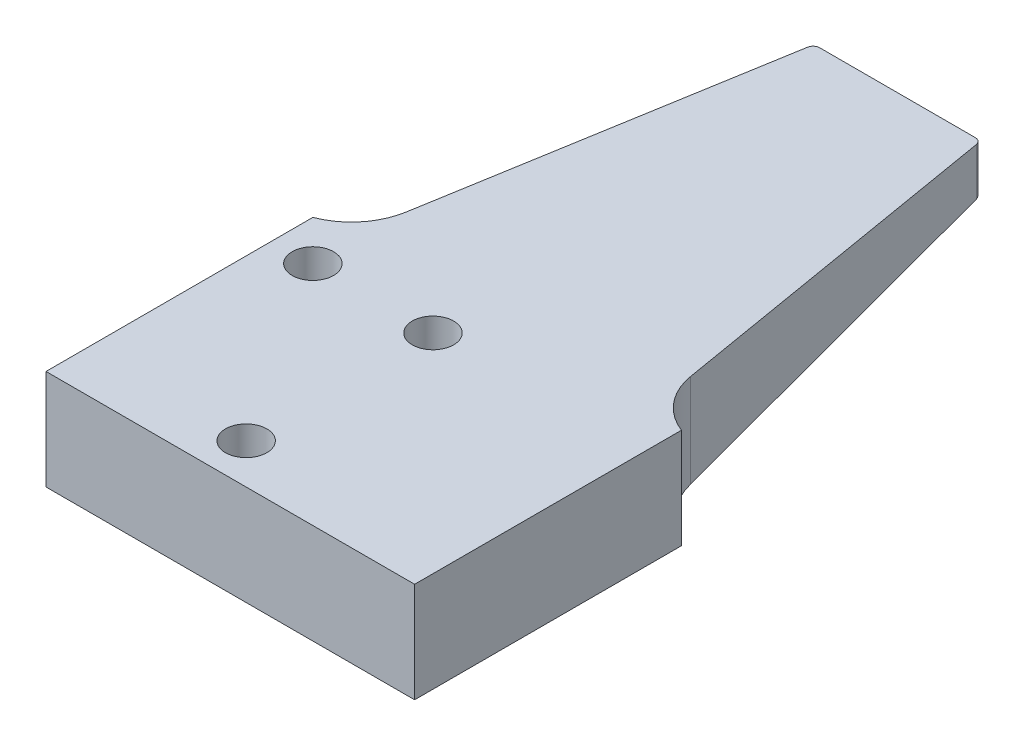
ISO-10303-21;
HEADER;
FILE_DESCRIPTION(('STEP AP214'),'2;1');
FILE_NAME('part.step','',(''),(''),'','','');
FILE_SCHEMA(('AUTOMOTIVE_DESIGN { 1 0 10303 214 1 1 1 1 }'));
ENDSEC;
DATA;
#1=APPLICATION_CONTEXT('core data for automotive mechanical design processes');
#2=APPLICATION_PROTOCOL_DEFINITION('international standard','automotive_design',2000,#1);
#3=PRODUCT_CONTEXT('',#1,'mechanical');
#4=PRODUCT('Part','Part','',(#3));
#5=PRODUCT_RELATED_PRODUCT_CATEGORY('part','',(#4));
#6=PRODUCT_DEFINITION_FORMATION('','',#4);
#7=PRODUCT_DEFINITION_CONTEXT('part definition',#1,'design');
#8=PRODUCT_DEFINITION('design','',#6,#7);
#9=PRODUCT_DEFINITION_SHAPE('','',#8);
#10=(LENGTH_UNIT() NAMED_UNIT(*) SI_UNIT(.MILLI.,.METRE.));
#11=(NAMED_UNIT(*) PLANE_ANGLE_UNIT() SI_UNIT($,.RADIAN.));
#12=(NAMED_UNIT(*) SI_UNIT($,.STERADIAN.) SOLID_ANGLE_UNIT());
#13=UNCERTAINTY_MEASURE_WITH_UNIT(LENGTH_MEASURE(1.E-05),#10,'distance_accuracy_value','');
#14=(GEOMETRIC_REPRESENTATION_CONTEXT(3) GLOBAL_UNCERTAINTY_ASSIGNED_CONTEXT((#13)) GLOBAL_UNIT_ASSIGNED_CONTEXT((#10,
#11,#12)) REPRESENTATION_CONTEXT('',''));
#15=CARTESIAN_POINT('',(0.,0.,0.));
#16=DIRECTION('',(0.,0.,1.));
#17=DIRECTION('',(1.,0.,0.));
#18=AXIS2_PLACEMENT_3D('',#15,#16,#17);
#19=CARTESIAN_POINT('',(24.,15.,-6.00000000000001));
#20=DIRECTION('',(0.,-1.,0.));
#21=DIRECTION('',(0.,0.,-1.));
#22=AXIS2_PLACEMENT_3D('',#19,#20,#21);
#23=CYLINDRICAL_SURFACE('',#22,1.6);
#24=CARTESIAN_POINT('',(24.,0.,-6.00000000000001));
#25=DIRECTION('',(0.,1.,0.));
#26=DIRECTION('',(0.,0.,1.));
#27=AXIS2_PLACEMENT_3D('',#24,#25,#26);
#28=CIRCLE('',#27,1.6);
#29=CARTESIAN_POINT('',(24.,0.,-4.40000000000001));
#30=VERTEX_POINT('',#29);
#31=EDGE_CURVE('E188',#30,#30,#28,.T.);
#32=ORIENTED_EDGE('',*,*,#31,.F.);
#33=EDGE_LOOP('',(#32));
#34=FACE_BOUND('',#33,.T.);
#35=CARTESIAN_POINT('',(24.,7.5,-6.00000000000001));
#36=DIRECTION('',(0.,1.,0.));
#37=DIRECTION('',(0.,0.,1.));
#38=AXIS2_PLACEMENT_3D('',#35,#36,#37);
#39=CIRCLE('',#38,1.6);
#40=CARTESIAN_POINT('',(24.,7.5,-4.40000000000001));
#41=VERTEX_POINT('',#40);
#42=EDGE_CURVE('E185',#41,#41,#39,.T.);
#43=ORIENTED_EDGE('',*,*,#42,.T.);
#44=EDGE_LOOP('',(#43));
#45=FACE_BOUND('',#44,.T.);
#46=ADVANCED_FACE('F35',(#34,#45),#23,.F.);
#47=CARTESIAN_POINT('',(6.,15.,-34.));
#48=DIRECTION('',(0.,-1.,0.));
#49=DIRECTION('',(0.,0.,-1.));
#50=AXIS2_PLACEMENT_3D('',#47,#48,#49);
#51=CYLINDRICAL_SURFACE('',#50,1.59999999999999);
#52=CARTESIAN_POINT('',(6.,0.,-34.));
#53=DIRECTION('',(0.,1.,0.));
#54=DIRECTION('',(0.,0.,1.));
#55=AXIS2_PLACEMENT_3D('',#52,#53,#54);
#56=CIRCLE('',#55,1.59999999999999);
#57=CARTESIAN_POINT('',(6.,0.,-32.4));
#58=VERTEX_POINT('',#57);
#59=EDGE_CURVE('E184',#58,#58,#56,.T.);
#60=ORIENTED_EDGE('',*,*,#59,.F.);
#61=EDGE_LOOP('',(#60));
#62=FACE_BOUND('',#61,.T.);
#63=CARTESIAN_POINT('',(6.,7.5,-34.));
#64=DIRECTION('',(0.,1.,0.));
#65=DIRECTION('',(0.,0.,1.));
#66=AXIS2_PLACEMENT_3D('',#63,#64,#65);
#67=CIRCLE('',#66,1.59999999999999);
#68=CARTESIAN_POINT('',(6.,7.5,-32.4));
#69=VERTEX_POINT('',#68);
#70=EDGE_CURVE('E210',#69,#69,#67,.T.);
#71=ORIENTED_EDGE('',*,*,#70,.T.);
#72=EDGE_LOOP('',(#71));
#73=FACE_BOUND('',#72,.T.);
#74=ADVANCED_FACE('F284',(#62,#73),#51,.F.);
#75=CARTESIAN_POINT('',(24.,15.,-34.));
#76=DIRECTION('',(0.,-1.,0.));
#77=DIRECTION('',(0.,0.,-1.));
#78=AXIS2_PLACEMENT_3D('',#75,#76,#77);
#79=CYLINDRICAL_SURFACE('',#78,1.60000000000001);
#80=CARTESIAN_POINT('',(24.,0.,-34.));
#81=DIRECTION('',(0.,1.,0.));
#82=DIRECTION('',(0.,0.,1.));
#83=AXIS2_PLACEMENT_3D('',#80,#81,#82);
#84=CIRCLE('',#83,1.60000000000001);
#85=CARTESIAN_POINT('',(24.,0.,-32.4));
#86=VERTEX_POINT('',#85);
#87=EDGE_CURVE('E181',#86,#86,#84,.T.);
#88=ORIENTED_EDGE('',*,*,#87,.F.);
#89=EDGE_LOOP('',(#88));
#90=FACE_BOUND('',#89,.T.);
#91=CARTESIAN_POINT('',(24.,7.5,-34.));
#92=DIRECTION('',(0.,1.,0.));
#93=DIRECTION('',(0.,0.,1.));
#94=AXIS2_PLACEMENT_3D('',#91,#92,#93);
#95=CIRCLE('',#94,1.60000000000001);
#96=CARTESIAN_POINT('',(24.,7.5,-32.4));
#97=VERTEX_POINT('',#96);
#98=EDGE_CURVE('E178',#97,#97,#95,.T.);
#99=ORIENTED_EDGE('',*,*,#98,.T.);
#100=EDGE_LOOP('',(#99));
#101=FACE_BOUND('',#100,.T.);
#102=ADVANCED_FACE('F290',(#90,#101),#79,.F.);
#103=CARTESIAN_POINT('',(0.,15.,0.));
#104=DIRECTION('',(0.,-1.,0.));
#105=DIRECTION('',(0.,0.,-1.));
#106=AXIS2_PLACEMENT_3D('',#103,#104,#105);
#107=PLANE('',#106);
#108=CARTESIAN_POINT('',(6.,15.,-34.));
#109=DIRECTION('',(0.,1.,0.));
#110=DIRECTION('',(0.,0.,1.));
#111=AXIS2_PLACEMENT_3D('',#108,#109,#110);
#112=CIRCLE('',#111,3.1);
#113=CARTESIAN_POINT('',(6.,15.,-30.9));
#114=VERTEX_POINT('',#113);
#115=EDGE_CURVE('E162',#114,#114,#112,.T.);
#116=ORIENTED_EDGE('',*,*,#115,.F.);
#117=EDGE_LOOP('',(#116));
#118=FACE_BOUND('',#117,.T.);
#119=CARTESIAN_POINT('',(24.,15.,-6.00000000000001));
#120=DIRECTION('',(0.,1.,0.));
#121=DIRECTION('',(0.,0.,1.));
#122=AXIS2_PLACEMENT_3D('',#119,#120,#121);
#123=CIRCLE('',#122,3.1);
#124=CARTESIAN_POINT('',(24.,15.,-2.90000000000001));
#125=VERTEX_POINT('',#124);
#126=EDGE_CURVE('E167',#125,#125,#123,.T.);
#127=ORIENTED_EDGE('',*,*,#126,.F.);
#128=EDGE_LOOP('',(#127));
#129=FACE_BOUND('',#128,.T.);
#130=CARTESIAN_POINT('',(24.,15.,-34.));
#131=DIRECTION('',(0.,1.,0.));
#132=DIRECTION('',(0.,0.,1.));
#133=AXIS2_PLACEMENT_3D('',#130,#131,#132);
#134=CIRCLE('',#133,3.1);
#135=CARTESIAN_POINT('',(24.,15.,-30.9));
#136=VERTEX_POINT('',#135);
#137=EDGE_CURVE('E166',#136,#136,#134,.T.);
#138=ORIENTED_EDGE('',*,*,#137,.F.);
#139=EDGE_LOOP('',(#138));
#140=FACE_BOUND('',#139,.T.);
#141=DIRECTION('',(-1.,0.,0.));
#142=VECTOR('',#141,1.);
#143=CARTESIAN_POINT('',(0.,15.,-100.));
#144=LINE('',#143,#142);
#145=CARTESIAN_POINT('',(39.2796116650082,15.,-100.));
#146=VERTEX_POINT('',#145);
#147=CARTESIAN_POINT('',(15.9703883349918,15.,-100.));
#148=VERTEX_POINT('',#147);
#149=EDGE_CURVE('E196',#146,#148,#144,.T.);
#150=ORIENTED_EDGE('',*,*,#149,.T.);
#151=CARTESIAN_POINT('',(15.9703883349918,15.,-99.));
#152=DIRECTION('',(0.,-1.,0.));
#153=DIRECTION('',(0.,0.,-1.));
#154=AXIS2_PLACEMENT_3D('',#151,#152,#153);
#155=CIRCLE('',#154,1.);
#156=CARTESIAN_POINT('',(14.9843295642147,15.,-99.1663974175686));
#157=VERTEX_POINT('',#156);
#158=EDGE_CURVE('E233',#148,#157,#155,.F.);
#159=ORIENTED_EDGE('',*,*,#158,.T.);
#160=DIRECTION('',(0.166397417568639,0.,-0.986058770777121));
#161=VECTOR('',#160,1.);
#162=CARTESIAN_POINT('',(15.125,15.,-100.));
#163=LINE('',#162,#161);
#164=CARTESIAN_POINT('',(6.295844231822,15.,-47.6790769293155));
#165=VERTEX_POINT('',#164);
#166=EDGE_CURVE('E126',#165,#157,#163,.T.);
#167=ORIENTED_EDGE('',*,*,#166,.F.);
#168=CARTESIAN_POINT('',(-3.56474347594922,15.,-49.3430511050019));
#169=DIRECTION('',(0.,-1.,0.));
#170=DIRECTION('',(0.,0.,-1.));
#171=AXIS2_PLACEMENT_3D('',#168,#169,#170);
#172=CIRCLE('',#171,10.);
#173=CARTESIAN_POINT('',(0.,15.,-40.));
#174=VERTEX_POINT('',#173);
#175=EDGE_CURVE('E119',#165,#174,#172,.T.);
#176=ORIENTED_EDGE('',*,*,#175,.T.);
#177=DIRECTION('',(0.,0.,1.));
#178=VECTOR('',#177,1.);
#179=CARTESIAN_POINT('',(0.,15.,0.));
#180=LINE('',#179,#178);
#181=CARTESIAN_POINT('',(0.,15.,0.));
#182=VERTEX_POINT('',#181);
#183=EDGE_CURVE('E123',#174,#182,#180,.T.);
#184=ORIENTED_EDGE('',*,*,#183,.T.);
#185=DIRECTION('',(1.,0.,0.));
#186=VECTOR('',#185,1.);
#187=CARTESIAN_POINT('',(0.,15.,0.));
#188=LINE('',#187,#186);
#189=CARTESIAN_POINT('',(55.25,15.,0.));
#190=VERTEX_POINT('',#189);
#191=EDGE_CURVE('E142',#182,#190,#188,.T.);
#192=ORIENTED_EDGE('',*,*,#191,.T.);
#193=DIRECTION('',(0.,0.,-1.));
#194=VECTOR('',#193,1.);
#195=CARTESIAN_POINT('',(55.25,15.,0.));
#196=LINE('',#195,#194);
#197=CARTESIAN_POINT('',(55.25,15.,-40.));
#198=VERTEX_POINT('',#197);
#199=EDGE_CURVE('E193',#190,#198,#196,.T.);
#200=ORIENTED_EDGE('',*,*,#199,.T.);
#201=CARTESIAN_POINT('',(58.8147434759492,15.,-49.3430511050019));
#202=DIRECTION('',(0.,-1.,0.));
#203=DIRECTION('',(0.,0.,-1.));
#204=AXIS2_PLACEMENT_3D('',#201,#202,#203);
#205=CIRCLE('',#204,10.);
#206=CARTESIAN_POINT('',(48.954155768178,15.,-47.6790769293155));
#207=VERTEX_POINT('',#206);
#208=EDGE_CURVE('E218',#198,#207,#205,.T.);
#209=ORIENTED_EDGE('',*,*,#208,.T.);
#210=DIRECTION('',(0.166397417568639,0.,0.986058770777121));
#211=VECTOR('',#210,1.);
#212=CARTESIAN_POINT('',(40.125,15.,-100.));
#213=LINE('',#212,#211);
#214=CARTESIAN_POINT('',(40.2656704357853,15.,-99.1663974175686));
#215=VERTEX_POINT('',#214);
#216=EDGE_CURVE('E157',#215,#207,#213,.T.);
#217=ORIENTED_EDGE('',*,*,#216,.F.);
#218=CARTESIAN_POINT('',(39.2796116650082,15.,-99.));
#219=DIRECTION('',(0.,-1.,0.));
#220=DIRECTION('',(0.,0.,-1.));
#221=AXIS2_PLACEMENT_3D('',#218,#219,#220);
#222=CIRCLE('',#221,1.);
#223=EDGE_CURVE('E231',#215,#146,#222,.F.);
#224=ORIENTED_EDGE('',*,*,#223,.T.);
#225=EDGE_LOOP('',(#150,#159,#167,#176,#184,#192,#200,#209,#217,#224));
#226=FACE_BOUND('',#225,.T.);
#227=ADVANCED_FACE('F122',(#118,#129,#140,#226),#107,.F.);
#228=CARTESIAN_POINT('',(0.,0.,0.));
#229=DIRECTION('',(0.,-1.,0.));
#230=DIRECTION('',(0.,0.,-1.));
#231=AXIS2_PLACEMENT_3D('',#228,#229,#230);
#232=PLANE('',#231);
#233=DIRECTION('',(0.,0.,1.));
#234=VECTOR('',#233,1.);
#235=CARTESIAN_POINT('',(0.,0.,0.));
#236=LINE('',#235,#234);
#237=CARTESIAN_POINT('',(0.,0.,-40.));
#238=VERTEX_POINT('',#237);
#239=CARTESIAN_POINT('',(0.,0.,0.));
#240=VERTEX_POINT('',#239);
#241=EDGE_CURVE('E190',#238,#240,#236,.T.);
#242=ORIENTED_EDGE('',*,*,#241,.F.);
#243=DIRECTION('',(1.,0.,0.));
#244=VECTOR('',#243,1.);
#245=CARTESIAN_POINT('',(-0.001000000000001,0.,-40.));
#246=LINE('',#245,#244);
#247=CARTESIAN_POINT('',(55.25,0.,-40.));
#248=VERTEX_POINT('',#247);
#249=EDGE_CURVE('E150',#238,#248,#246,.T.);
#250=ORIENTED_EDGE('',*,*,#249,.T.);
#251=DIRECTION('',(0.,0.,-1.));
#252=VECTOR('',#251,1.);
#253=CARTESIAN_POINT('',(55.25,0.,0.));
#254=LINE('',#253,#252);
#255=CARTESIAN_POINT('',(55.25,0.,0.));
#256=VERTEX_POINT('',#255);
#257=EDGE_CURVE('E143',#256,#248,#254,.T.);
#258=ORIENTED_EDGE('',*,*,#257,.F.);
#259=DIRECTION('',(1.,0.,0.));
#260=VECTOR('',#259,1.);
#261=CARTESIAN_POINT('',(0.,0.,0.));
#262=LINE('',#261,#260);
#263=EDGE_CURVE('E200',#240,#256,#262,.T.);
#264=ORIENTED_EDGE('',*,*,#263,.F.);
#265=EDGE_LOOP('',(#242,#250,#258,#264));
#266=FACE_BOUND('',#265,.T.);
#267=ORIENTED_EDGE('',*,*,#59,.T.);
#268=EDGE_LOOP('',(#267));
#269=FACE_BOUND('',#268,.T.);
#270=ORIENTED_EDGE('',*,*,#31,.T.);
#271=EDGE_LOOP('',(#270));
#272=FACE_BOUND('',#271,.T.);
#273=ORIENTED_EDGE('',*,*,#87,.T.);
#274=EDGE_LOOP('',(#273));
#275=FACE_BOUND('',#274,.T.);
#276=ADVANCED_FACE('F270',(#266,#269,#272,#275),#232,.T.);
#277=CARTESIAN_POINT('',(0.,15.,0.));
#278=DIRECTION('',(1.,0.,0.));
#279=DIRECTION('',(0.,0.,-1.));
#280=AXIS2_PLACEMENT_3D('',#277,#278,#279);
#281=PLANE('',#280);
#282=ORIENTED_EDGE('',*,*,#183,.F.);
#283=DIRECTION('',(0.,1.,0.));
#284=VECTOR('',#283,1.);
#285=CARTESIAN_POINT('',(0.,-0.000999999999999265,-40.));
#286=LINE('',#285,#284);
#287=EDGE_CURVE('E138',#238,#174,#286,.T.);
#288=ORIENTED_EDGE('',*,*,#287,.F.);
#289=ORIENTED_EDGE('',*,*,#241,.T.);
#290=DIRECTION('',(0.,-1.,0.));
#291=VECTOR('',#290,1.);
#292=CARTESIAN_POINT('',(0.,15.,0.));
#293=LINE('',#292,#291);
#294=EDGE_CURVE('E141',#182,#240,#293,.T.);
#295=ORIENTED_EDGE('',*,*,#294,.F.);
#296=EDGE_LOOP('',(#282,#288,#289,#295));
#297=FACE_BOUND('',#296,.T.);
#298=ADVANCED_FACE('F137',(#297),#281,.F.);
#299=CARTESIAN_POINT('',(0.,15.,0.));
#300=DIRECTION('',(0.,0.,-1.));
#301=DIRECTION('',(-1.,0.,0.));
#302=AXIS2_PLACEMENT_3D('',#299,#300,#301);
#303=PLANE('',#302);
#304=ORIENTED_EDGE('',*,*,#263,.T.);
#305=DIRECTION('',(0.,-1.,0.));
#306=VECTOR('',#305,1.);
#307=CARTESIAN_POINT('',(55.25,15.,0.));
#308=LINE('',#307,#306);
#309=EDGE_CURVE('E198',#190,#256,#308,.T.);
#310=ORIENTED_EDGE('',*,*,#309,.F.);
#311=ORIENTED_EDGE('',*,*,#191,.F.);
#312=ORIENTED_EDGE('',*,*,#294,.T.);
#313=EDGE_LOOP('',(#304,#310,#311,#312));
#314=FACE_BOUND('',#313,.T.);
#315=ADVANCED_FACE('F273',(#314),#303,.F.);
#316=CARTESIAN_POINT('',(55.25,15.,0.));
#317=DIRECTION('',(-1.,0.,0.));
#318=DIRECTION('',(0.,0.,1.));
#319=AXIS2_PLACEMENT_3D('',#316,#317,#318);
#320=PLANE('',#319);
#321=ORIENTED_EDGE('',*,*,#257,.T.);
#322=DIRECTION('',(0.,1.,0.));
#323=VECTOR('',#322,1.);
#324=CARTESIAN_POINT('',(55.25,-0.000999999999999265,-40.));
#325=LINE('',#324,#323);
#326=EDGE_CURVE('E152',#248,#198,#325,.T.);
#327=ORIENTED_EDGE('',*,*,#326,.T.);
#328=ORIENTED_EDGE('',*,*,#199,.F.);
#329=ORIENTED_EDGE('',*,*,#309,.T.);
#330=EDGE_LOOP('',(#321,#327,#328,#329));
#331=FACE_BOUND('',#330,.T.);
#332=ADVANCED_FACE('F265',(#331),#320,.F.);
#333=CARTESIAN_POINT('',(0.,15.,-100.));
#334=DIRECTION('',(0.,0.,1.));
#335=DIRECTION('',(1.,0.,0.));
#336=AXIS2_PLACEMENT_3D('',#333,#334,#335);
#337=PLANE('',#336);
#338=DIRECTION('',(1.,0.,0.));
#339=VECTOR('',#338,1.);
#340=CARTESIAN_POINT('',(0.,8.87551639669477,-100.));
#341=LINE('',#340,#339);
#342=CARTESIAN_POINT('',(39.2796116650082,8.87551639669477,-100.));
#343=VERTEX_POINT('',#342);
#344=CARTESIAN_POINT('',(15.9703883349918,8.87551639669477,-100.));
#345=VERTEX_POINT('',#344);
#346=EDGE_CURVE('E226',#343,#345,#341,.F.);
#347=ORIENTED_EDGE('',*,*,#346,.T.);
#348=DIRECTION('',(0.,1.,0.));
#349=VECTOR('',#348,1.);
#350=CARTESIAN_POINT('',(15.9703883349918,15.,-100.));
#351=LINE('',#350,#349);
#352=EDGE_CURVE('E228',#345,#148,#351,.T.);
#353=ORIENTED_EDGE('',*,*,#352,.T.);
#354=ORIENTED_EDGE('',*,*,#149,.F.);
#355=DIRECTION('',(0.,1.,0.));
#356=VECTOR('',#355,1.);
#357=CARTESIAN_POINT('',(39.2796116650082,15.,-100.));
#358=LINE('',#357,#356);
#359=EDGE_CURVE('E224',#146,#343,#358,.F.);
#360=ORIENTED_EDGE('',*,*,#359,.T.);
#361=EDGE_LOOP('',(#347,#353,#354,#360));
#362=FACE_BOUND('',#361,.T.);
#363=ADVANCED_FACE('F280',(#362),#337,.F.);
#364=CARTESIAN_POINT('',(24.,7.5,-34.));
#365=DIRECTION('',(0.,1.,0.));
#366=DIRECTION('',(0.,0.,1.));
#367=AXIS2_PLACEMENT_3D('',#364,#365,#366);
#368=CYLINDRICAL_SURFACE('',#367,3.1);
#369=CARTESIAN_POINT('',(24.,7.5,-34.));
#370=DIRECTION('',(0.,1.,0.));
#371=DIRECTION('',(0.,0.,1.));
#372=AXIS2_PLACEMENT_3D('',#369,#370,#371);
#373=CIRCLE('',#372,3.1);
#374=CARTESIAN_POINT('',(24.,7.5,-30.9));
#375=VERTEX_POINT('',#374);
#376=EDGE_CURVE('E175',#375,#375,#373,.T.);
#377=ORIENTED_EDGE('',*,*,#376,.F.);
#378=EDGE_LOOP('',(#377));
#379=FACE_BOUND('',#378,.T.);
#380=ORIENTED_EDGE('',*,*,#137,.T.);
#381=EDGE_LOOP('',(#380));
#382=FACE_BOUND('',#381,.T.);
#383=ADVANCED_FACE('F303',(#379,#382),#368,.F.);
#384=CARTESIAN_POINT('',(24.,7.5,-34.));
#385=DIRECTION('',(0.,1.,0.));
#386=DIRECTION('',(0.,0.,1.));
#387=AXIS2_PLACEMENT_3D('',#384,#385,#386);
#388=PLANE('',#387);
#389=ORIENTED_EDGE('',*,*,#98,.F.);
#390=EDGE_LOOP('',(#389));
#391=FACE_BOUND('',#390,.T.);
#392=ORIENTED_EDGE('',*,*,#376,.T.);
#393=EDGE_LOOP('',(#392));
#394=FACE_BOUND('',#393,.T.);
#395=ADVANCED_FACE('F308',(#391,#394),#388,.T.);
#396=CARTESIAN_POINT('',(6.,7.5,-34.));
#397=DIRECTION('',(0.,1.,0.));
#398=DIRECTION('',(0.,0.,1.));
#399=AXIS2_PLACEMENT_3D('',#396,#397,#398);
#400=CYLINDRICAL_SURFACE('',#399,3.1);
#401=CARTESIAN_POINT('',(6.,7.5,-34.));
#402=DIRECTION('',(0.,1.,0.));
#403=DIRECTION('',(0.,0.,1.));
#404=AXIS2_PLACEMENT_3D('',#401,#402,#403);
#405=CIRCLE('',#404,3.1);
#406=CARTESIAN_POINT('',(6.,7.5,-30.9));
#407=VERTEX_POINT('',#406);
#408=EDGE_CURVE('E170',#407,#407,#405,.T.);
#409=ORIENTED_EDGE('',*,*,#408,.F.);
#410=EDGE_LOOP('',(#409));
#411=FACE_BOUND('',#410,.T.);
#412=ORIENTED_EDGE('',*,*,#115,.T.);
#413=EDGE_LOOP('',(#412));
#414=FACE_BOUND('',#413,.T.);
#415=ADVANCED_FACE('F337',(#411,#414),#400,.F.);
#416=CARTESIAN_POINT('',(6.,7.5,-34.));
#417=DIRECTION('',(0.,1.,0.));
#418=DIRECTION('',(0.,0.,1.));
#419=AXIS2_PLACEMENT_3D('',#416,#417,#418);
#420=PLANE('',#419);
#421=ORIENTED_EDGE('',*,*,#70,.F.);
#422=EDGE_LOOP('',(#421));
#423=FACE_BOUND('',#422,.T.);
#424=ORIENTED_EDGE('',*,*,#408,.T.);
#425=EDGE_LOOP('',(#424));
#426=FACE_BOUND('',#425,.T.);
#427=ADVANCED_FACE('F333',(#423,#426),#420,.T.);
#428=CARTESIAN_POINT('',(24.,7.5,-6.00000000000001));
#429=DIRECTION('',(0.,1.,0.));
#430=DIRECTION('',(0.,0.,1.));
#431=AXIS2_PLACEMENT_3D('',#428,#429,#430);
#432=CYLINDRICAL_SURFACE('',#431,3.1);
#433=CARTESIAN_POINT('',(24.,7.5,-6.00000000000001));
#434=DIRECTION('',(0.,1.,0.));
#435=DIRECTION('',(0.,0.,1.));
#436=AXIS2_PLACEMENT_3D('',#433,#434,#435);
#437=CIRCLE('',#436,3.1);
#438=CARTESIAN_POINT('',(24.,7.5,-2.90000000000001));
#439=VERTEX_POINT('',#438);
#440=EDGE_CURVE('E163',#439,#439,#437,.T.);
#441=ORIENTED_EDGE('',*,*,#440,.F.);
#442=EDGE_LOOP('',(#441));
#443=FACE_BOUND('',#442,.T.);
#444=ORIENTED_EDGE('',*,*,#126,.T.);
#445=EDGE_LOOP('',(#444));
#446=FACE_BOUND('',#445,.T.);
#447=ADVANCED_FACE('F329',(#443,#446),#432,.F.);
#448=CARTESIAN_POINT('',(24.,7.5,-6.00000000000001));
#449=DIRECTION('',(0.,1.,0.));
#450=DIRECTION('',(0.,0.,1.));
#451=AXIS2_PLACEMENT_3D('',#448,#449,#450);
#452=PLANE('',#451);
#453=ORIENTED_EDGE('',*,*,#42,.F.);
#454=EDGE_LOOP('',(#453));
#455=FACE_BOUND('',#454,.T.);
#456=ORIENTED_EDGE('',*,*,#440,.T.);
#457=EDGE_LOOP('',(#456));
#458=FACE_BOUND('',#457,.T.);
#459=ADVANCED_FACE('F326',(#455,#458),#452,.T.);
#460=CARTESIAN_POINT('',(-0.001000000000001,0.,-40.));
#461=DIRECTION('',(0.,0.991227900682635,0.132163720091018));
#462=DIRECTION('',(0.,-0.132163720091018,0.991227900682635));
#463=AXIS2_PLACEMENT_3D('',#460,#461,#462);
#464=PLANE('',#463);
#465=DIRECTION('',(-0.164977662201585,-0.130352720751869,0.977645405639021));
#466=VECTOR('',#465,1.);
#467=CARTESIAN_POINT('',(14.9529361976628,7.86404835370887,-98.9803626528166));
#468=LINE('',#467,#466);
#469=CARTESIAN_POINT('',(14.9785526277654,7.88428849601214,-99.132163720091));
#470=VERTEX_POINT('',#469);
#471=CARTESIAN_POINT('',(6.29584423182199,1.02387692390874,-47.6790769293155));
#472=VERTEX_POINT('',#471);
#473=EDGE_CURVE('E148',#470,#472,#468,.T.);
#474=ORIENTED_EDGE('',*,*,#473,.F.);
#475=DIRECTION('',(1.,0.,0.));
#476=VECTOR('',#475,1.);
#477=CARTESIAN_POINT('',(-0.001000000000001,7.88428849601214,-99.132163720091));
#478=LINE('',#477,#476);
#479=CARTESIAN_POINT('',(40.2714473722346,7.88428849601214,-99.132163720091));
#480=VERTEX_POINT('',#479);
#481=EDGE_CURVE('E58',#470,#480,#478,.T.);
#482=ORIENTED_EDGE('',*,*,#481,.T.);
#483=DIRECTION('',(-0.164977662201585,0.130352720751869,-0.977645405639021));
#484=VECTOR('',#483,1.);
#485=CARTESIAN_POINT('',(40.2970638023372,7.86404835370887,-98.9803626528166));
#486=LINE('',#485,#484);
#487=CARTESIAN_POINT('',(48.954155768178,1.02387692390874,-47.6790769293155));
#488=VERTEX_POINT('',#487);
#489=EDGE_CURVE('E155',#488,#480,#486,.T.);
#490=ORIENTED_EDGE('',*,*,#489,.F.);
#491=CARTESIAN_POINT('',(58.8147434759492,1.24574014733359,-49.3430511050019));
#492=DIRECTION('',(0.,0.991227900682635,0.132163720091018));
#493=DIRECTION('',(0.,-0.132163720091018,0.991227900682635));
#494=AXIS2_PLACEMENT_3D('',#491,#492,#493);
#495=ELLIPSE('',#494,10.088497300281,10.);
#496=EDGE_CURVE('E221',#488,#248,#495,.T.);
#497=ORIENTED_EDGE('',*,*,#496,.T.);
#498=ORIENTED_EDGE('',*,*,#249,.F.);
#499=CARTESIAN_POINT('',(-3.56474347594922,1.24574014733359,-49.3430511050019));
#500=DIRECTION('',(0.,0.991227900682635,0.132163720091018));
#501=DIRECTION('',(0.,0.132163720091018,-0.991227900682635));
#502=AXIS2_PLACEMENT_3D('',#499,#500,#501);
#503=ELLIPSE('',#502,10.088497300281,10.);
#504=EDGE_CURVE('E131',#238,#472,#503,.T.);
#505=ORIENTED_EDGE('',*,*,#504,.T.);
#506=EDGE_LOOP('',(#474,#482,#490,#497,#498,#505));
#507=FACE_BOUND('',#506,.T.);
#508=ADVANCED_FACE('F263',(#507),#464,.F.);
#509=CARTESIAN_POINT('',(40.125,-0.000999999999999265,-100.));
#510=DIRECTION('',(-0.986058770777121,0.,0.166397417568639));
#511=DIRECTION('',(0.166397417568639,0.,0.986058770777122));
#512=AXIS2_PLACEMENT_3D('',#509,#510,#511);
#513=PLANE('',#512);
#514=ORIENTED_EDGE('',*,*,#489,.T.);
#515=CARTESIAN_POINT('',(40.29375,8.87551639669477,-99.));
#516=DIRECTION('',(-0.986058770777121,0.,0.166397417568639));
#517=DIRECTION('',(0.166397417568639,0.,0.986058770777122));
#518=AXIS2_PLACEMENT_3D('',#515,#516,#517);
#519=ELLIPSE('',#518,1.01413833499183,1.);
#520=CARTESIAN_POINT('',(40.2656704357853,7.88945762591765,-99.1663974175686));
#521=VERTEX_POINT('',#520);
#522=EDGE_CURVE('E11',#480,#521,#519,.F.);
#523=ORIENTED_EDGE('',*,*,#522,.T.);
#524=DIRECTION('',(0.,1.,0.));
#525=VECTOR('',#524,1.);
#526=CARTESIAN_POINT('',(40.2656704357853,-0.000999999999999265,-99.1663974175686));
#527=LINE('',#526,#525);
#528=EDGE_CURVE('E44',#521,#215,#527,.T.);
#529=ORIENTED_EDGE('',*,*,#528,.T.);
#530=ORIENTED_EDGE('',*,*,#216,.T.);
#531=DIRECTION('',(0.,-1.,0.));
#532=VECTOR('',#531,1.);
#533=CARTESIAN_POINT('',(48.954155768178,-0.000999999999999265,-47.6790769293155));
#534=LINE('',#533,#532);
#535=EDGE_CURVE('E132',#207,#488,#534,.T.);
#536=ORIENTED_EDGE('',*,*,#535,.T.);
#537=EDGE_LOOP('',(#514,#523,#529,#530,#536));
#538=FACE_BOUND('',#537,.T.);
#539=ADVANCED_FACE('F255',(#538),#513,.F.);
#540=CARTESIAN_POINT('',(15.125,-0.000999999999999265,-100.));
#541=DIRECTION('',(0.986058770777121,0.,0.166397417568639));
#542=DIRECTION('',(0.166397417568639,0.,-0.986058770777122));
#543=AXIS2_PLACEMENT_3D('',#540,#541,#542);
#544=PLANE('',#543);
#545=ORIENTED_EDGE('',*,*,#166,.T.);
#546=DIRECTION('',(0.,1.,0.));
#547=VECTOR('',#546,1.);
#548=CARTESIAN_POINT('',(14.9843295642147,-0.000999999999999265,-99.1663974175686));
#549=LINE('',#548,#547);
#550=CARTESIAN_POINT('',(14.9843295642147,7.88945762591765,-99.1663974175686));
#551=VERTEX_POINT('',#550);
#552=EDGE_CURVE('E237',#157,#551,#549,.F.);
#553=ORIENTED_EDGE('',*,*,#552,.T.);
#554=CARTESIAN_POINT('',(14.95625,8.87551639669477,-99.));
#555=DIRECTION('',(0.986058770777121,0.,0.166397417568639));
#556=DIRECTION('',(0.166397417568639,0.,-0.986058770777122));
#557=AXIS2_PLACEMENT_3D('',#554,#555,#556);
#558=ELLIPSE('',#557,1.01413833499183,1.);
#559=EDGE_CURVE('E235',#551,#470,#558,.F.);
#560=ORIENTED_EDGE('',*,*,#559,.T.);
#561=ORIENTED_EDGE('',*,*,#473,.T.);
#562=DIRECTION('',(0.,1.,0.));
#563=VECTOR('',#562,1.);
#564=CARTESIAN_POINT('',(6.29584423182199,-0.000999999999999265,-47.6790769293155));
#565=LINE('',#564,#563);
#566=EDGE_CURVE('E207',#472,#165,#565,.T.);
#567=ORIENTED_EDGE('',*,*,#566,.T.);
#568=EDGE_LOOP('',(#545,#553,#560,#561,#567));
#569=FACE_BOUND('',#568,.T.);
#570=ADVANCED_FACE('F314',(#569),#544,.F.);
#571=CARTESIAN_POINT('',(-3.56474347594922,-0.000999999999999265,-49.3430511050019));
#572=DIRECTION('',(0.,1.,0.));
#573=DIRECTION('',(0.,0.,1.));
#574=AXIS2_PLACEMENT_3D('',#571,#572,#573);
#575=CYLINDRICAL_SURFACE('',#574,10.);
#576=ORIENTED_EDGE('',*,*,#504,.F.);
#577=ORIENTED_EDGE('',*,*,#287,.T.);
#578=ORIENTED_EDGE('',*,*,#175,.F.);
#579=ORIENTED_EDGE('',*,*,#566,.F.);
#580=EDGE_LOOP('',(#576,#577,#578,#579));
#581=FACE_BOUND('',#580,.T.);
#582=ADVANCED_FACE('F146',(#581),#575,.F.);
#583=CARTESIAN_POINT('',(58.8147434759492,-0.000999999999999265,-49.3430511050019));
#584=DIRECTION('',(0.,-1.,0.));
#585=DIRECTION('',(0.,0.,-1.));
#586=AXIS2_PLACEMENT_3D('',#583,#584,#585);
#587=CYLINDRICAL_SURFACE('',#586,10.);
#588=ORIENTED_EDGE('',*,*,#496,.F.);
#589=ORIENTED_EDGE('',*,*,#535,.F.);
#590=ORIENTED_EDGE('',*,*,#208,.F.);
#591=ORIENTED_EDGE('',*,*,#326,.F.);
#592=EDGE_LOOP('',(#588,#589,#590,#591));
#593=FACE_BOUND('',#592,.T.);
#594=ADVANCED_FACE('F262',(#593),#587,.F.);
#595=CARTESIAN_POINT('',(39.2796116650082,-0.000999999999999265,-99.));
#596=DIRECTION('',(0.,1.,0.));
#597=DIRECTION('',(0.,0.,1.));
#598=AXIS2_PLACEMENT_3D('',#595,#596,#597);
#599=CYLINDRICAL_SURFACE('',#598,1.);
#600=ORIENTED_EDGE('',*,*,#223,.F.);
#601=ORIENTED_EDGE('',*,*,#528,.F.);
#602=CARTESIAN_POINT('',(39.2796116650082,8.87551639669477,-99.));
#603=DIRECTION('',(0.707106781186547,0.707106781186547,0.));
#604=DIRECTION('',(-0.707106781186547,0.707106781186547,0.));
#605=AXIS2_PLACEMENT_3D('',#602,#603,#604);
#606=ELLIPSE('',#605,1.41421356237309,1.);
#607=EDGE_CURVE('E39',#343,#521,#606,.F.);
#608=ORIENTED_EDGE('',*,*,#607,.F.);
#609=ORIENTED_EDGE('',*,*,#359,.F.);
#610=EDGE_LOOP('',(#600,#601,#608,#609));
#611=FACE_BOUND('',#610,.T.);
#612=ADVANCED_FACE('F37',(#611),#599,.T.);
#613=CARTESIAN_POINT('',(-0.001000000000001,8.87551639669477,-99.));
#614=DIRECTION('',(1.,0.,0.));
#615=DIRECTION('',(0.,0.,-1.));
#616=AXIS2_PLACEMENT_3D('',#613,#614,#615);
#617=CYLINDRICAL_SURFACE('',#616,1.);
#618=ORIENTED_EDGE('',*,*,#481,.F.);
#619=ORIENTED_EDGE('',*,*,#559,.F.);
#620=CARTESIAN_POINT('',(15.9703883349918,8.87551639669477,-99.));
#621=DIRECTION('',(0.707106781186547,-0.707106781186547,0.));
#622=DIRECTION('',(0.707106781186547,0.707106781186547,0.));
#623=AXIS2_PLACEMENT_3D('',#620,#621,#622);
#624=ELLIPSE('',#623,1.41421356237309,1.);
#625=EDGE_CURVE('E240',#345,#551,#624,.F.);
#626=ORIENTED_EDGE('',*,*,#625,.F.);
#627=ORIENTED_EDGE('',*,*,#346,.F.);
#628=ORIENTED_EDGE('',*,*,#607,.T.);
#629=ORIENTED_EDGE('',*,*,#522,.F.);
#630=EDGE_LOOP('',(#618,#619,#626,#627,#628,#629));
#631=FACE_BOUND('',#630,.T.);
#632=ADVANCED_FACE('F250',(#631),#617,.T.);
#633=CARTESIAN_POINT('',(15.9703883349918,15.,-99.));
#634=DIRECTION('',(0.,1.,0.));
#635=DIRECTION('',(0.,0.,1.));
#636=AXIS2_PLACEMENT_3D('',#633,#634,#635);
#637=CYLINDRICAL_SURFACE('',#636,1.);
#638=ORIENTED_EDGE('',*,*,#625,.T.);
#639=ORIENTED_EDGE('',*,*,#552,.F.);
#640=ORIENTED_EDGE('',*,*,#158,.F.);
#641=ORIENTED_EDGE('',*,*,#352,.F.);
#642=EDGE_LOOP('',(#638,#639,#640,#641));
#643=FACE_BOUND('',#642,.T.);
#644=ADVANCED_FACE('F312',(#643),#637,.T.);
#645=CLOSED_SHELL('',(#46,#74,#102,#227,#276,#298,#315,#332,#363,#383,#395,#415,#427,#447,#459,
#508,#539,#570,#582,#594,#612,#632,#644));
#646=MANIFOLD_SOLID_BREP('B2',#645);
#647=ADVANCED_BREP_SHAPE_REPRESENTATION('',(#18,#646),#14);
#648=SHAPE_DEFINITION_REPRESENTATION(#9,#647);
ENDSEC;
END-ISO-10303-21;
